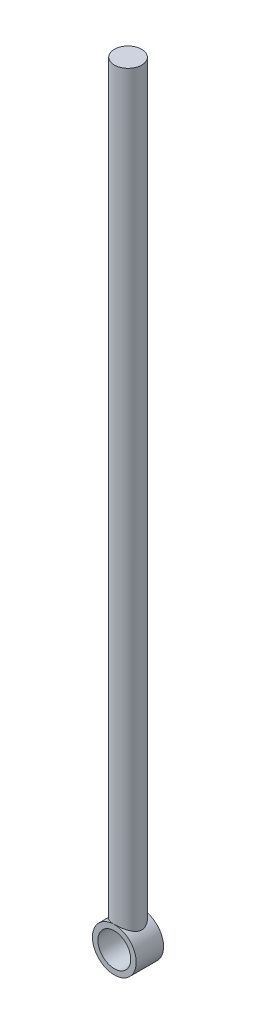
ISO-10303-21;
HEADER;
FILE_DESCRIPTION(('STEP AP214'),'2;1');
FILE_NAME('part.step','',(''),(''),'','','');
FILE_SCHEMA(('AUTOMOTIVE_DESIGN { 1 0 10303 214 1 1 1 1 }'));
ENDSEC;
DATA;
#1=APPLICATION_CONTEXT('core data for automotive mechanical design processes');
#2=APPLICATION_PROTOCOL_DEFINITION('international standard','automotive_design',2000,#1);
#3=PRODUCT_CONTEXT('',#1,'mechanical');
#4=PRODUCT('Part','Part','',(#3));
#5=PRODUCT_RELATED_PRODUCT_CATEGORY('part','',(#4));
#6=PRODUCT_DEFINITION_FORMATION('','',#4);
#7=PRODUCT_DEFINITION_CONTEXT('part definition',#1,'design');
#8=PRODUCT_DEFINITION('design','',#6,#7);
#9=PRODUCT_DEFINITION_SHAPE('','',#8);
#10=(LENGTH_UNIT() NAMED_UNIT(*) SI_UNIT(.MILLI.,.METRE.));
#11=(NAMED_UNIT(*) PLANE_ANGLE_UNIT() SI_UNIT($,.RADIAN.));
#12=(NAMED_UNIT(*) SI_UNIT($,.STERADIAN.) SOLID_ANGLE_UNIT());
#13=UNCERTAINTY_MEASURE_WITH_UNIT(LENGTH_MEASURE(1.E-05),#10,'distance_accuracy_value','');
#14=(GEOMETRIC_REPRESENTATION_CONTEXT(3) GLOBAL_UNCERTAINTY_ASSIGNED_CONTEXT((#13)) GLOBAL_UNIT_ASSIGNED_CONTEXT((#10,
#11,#12)) REPRESENTATION_CONTEXT('',''));
#15=CARTESIAN_POINT('',(0.,0.,0.));
#16=DIRECTION('',(0.,0.,1.));
#17=DIRECTION('',(1.,0.,0.));
#18=AXIS2_PLACEMENT_3D('',#15,#16,#17);
#19=CARTESIAN_POINT('',(0.,0.,5.));
#20=DIRECTION('',(0.,0.,-1.));
#21=DIRECTION('',(-1.,0.,0.));
#22=AXIS2_PLACEMENT_3D('',#19,#20,#21);
#23=CYLINDRICAL_SURFACE('',#22,4.);
#24=CARTESIAN_POINT('',(0.,0.,5.));
#25=DIRECTION('',(0.,0.,1.));
#26=DIRECTION('',(1.,0.,0.));
#27=AXIS2_PLACEMENT_3D('',#24,#25,#26);
#28=CIRCLE('',#27,4.);
#29=CARTESIAN_POINT('',(4.,0.,5.));
#30=VERTEX_POINT('',#29);
#31=EDGE_CURVE('E91',#30,#30,#28,.T.);
#32=ORIENTED_EDGE('',*,*,#31,.F.);
#33=EDGE_LOOP('',(#32));
#34=FACE_BOUND('',#33,.T.);
#35=CARTESIAN_POINT('',(-0.212094342694303,3.99437304089103,0.));
#36=CARTESIAN_POINT('',(-0.277635425408281,3.99090636161698,0.00556866203034279));
#37=CARTESIAN_POINT('',(-0.342852676372404,3.98581278387243,0.0137382670174154));
#38=CARTESIAN_POINT('',(-0.472097905739335,3.97256994083765,0.0350971233239997));
#39=CARTESIAN_POINT('',(-0.536126716926794,3.96442290714975,0.0482827088455906));
#40=CARTESIAN_POINT('',(-0.662161392903697,3.9453246032861,0.0794038382104378));
#41=CARTESIAN_POINT('',(-0.724177284261335,3.93439090418593,0.0973096425499083));
#42=CARTESIAN_POINT('',(-0.84618327217585,3.90996807056487,0.137668606910204));
#43=CARTESIAN_POINT('',(-0.906173063040739,3.89647855244111,0.160122449581061));
#44=CARTESIAN_POINT('',(-1.08224499252167,3.85270057759922,0.233803993620125));
#45=CARTESIAN_POINT('',(-1.19487399066409,3.81903209572113,0.291463555467339));
#46=CARTESIAN_POINT('',(-1.40879154869735,3.74541936662533,0.421912692963679));
#47=CARTESIAN_POINT('',(-1.51006269615616,3.70546570308566,0.494725023878487));
#48=CARTESIAN_POINT('',(-1.70923895341809,3.61820793944922,0.661514878389953));
#49=CARTESIAN_POINT('',(-1.80584974069344,3.57056704741322,0.756864866122376));
#50=CARTESIAN_POINT('',(-1.98260843390093,3.47553717490005,0.962045322727953));
#51=CARTESIAN_POINT('',(-2.06273406457208,3.42814861847129,1.07189505955946));
#52=CARTESIAN_POINT('',(-2.21184459422436,3.33410266150031,1.31621294161143));
#53=CARTESIAN_POINT('',(-2.27899628040701,3.28796156360036,1.45203532985045));
#54=CARTESIAN_POINT('',(-2.36100245199905,3.22905683183157,1.6654736906845));
#55=CARTESIAN_POINT('',(-2.38520649617299,3.21114928885188,1.7381792903859));
#56=CARTESIAN_POINT('',(-2.42700372583669,3.17967482004999,1.88635850571834));
#57=CARTESIAN_POINT('',(-2.44460049584837,3.16610554126497,1.96183059603114));
#58=CARTESIAN_POINT('',(-2.47868512930007,3.13955335327286,2.14704072569847));
#59=CARTESIAN_POINT('',(-2.49160464668836,3.12920923519556,2.25785987214205));
#60=CARTESIAN_POINT('',(-2.5024632186234,3.12053365161235,2.48062653628668));
#61=CARTESIAN_POINT('',(-2.50041209710871,3.1221943084017,2.59257326588967));
#62=CARTESIAN_POINT('',(-2.48151124325573,3.13723377012631,2.81418274646222));
#63=CARTESIAN_POINT('',(-2.46468593877979,3.15059323197699,2.92384896181254));
#64=CARTESIAN_POINT('',(-2.41720912027568,3.18715878288787,3.13844927894854));
#65=CARTESIAN_POINT('',(-2.38654532335623,3.21037361837949,3.24337908553936));
#66=CARTESIAN_POINT('',(-2.31013941406388,3.26582590876777,3.45358964441859));
#67=CARTESIAN_POINT('',(-2.26351640756705,3.29856813538876,3.55841242845811));
#68=CARTESIAN_POINT('',(-2.15730444644563,3.36899086307536,3.75944310482348));
#69=CARTESIAN_POINT('',(-2.09770885684788,3.40667388723078,3.8556465530194));
#70=CARTESIAN_POINT('',(-1.95243354883458,3.49235572493626,4.05838002000874));
#71=CARTESIAN_POINT('',(-1.86390045238364,3.54082925755464,4.16267651505651));
#72=CARTESIAN_POINT('',(-1.67050984340395,3.63607424533146,4.35595454843289));
#73=CARTESIAN_POINT('',(-1.56563768563211,3.68284412659139,4.44492219486299));
#74=CARTESIAN_POINT('',(-1.33170912006632,3.77406382913035,4.6120372090512));
#75=CARTESIAN_POINT('',(-1.20137331046223,3.81800683714295,4.68869378670754));
#76=CARTESIAN_POINT('',(-0.926143315906754,3.89391077340457,4.81806444289206));
#77=CARTESIAN_POINT('',(-0.781268891998625,3.92588769368969,4.87081049664175));
#78=CARTESIAN_POINT('',(-0.499942810841997,3.9708730146435,4.94426244543754));
#79=CARTESIAN_POINT('',(-0.364599514477382,3.98571112884782,4.96807757360525));
#80=CARTESIAN_POINT('',(-0.0910689172232064,4.00130122676496,4.99308967147354));
#81=CARTESIAN_POINT('',(0.0471160269325314,4.00206444649915,4.99430468290718));
#82=CARTESIAN_POINT('',(0.304491305142984,3.99022136999018,4.97531773343442));
#83=CARTESIAN_POINT('',(0.423959101005391,3.9792195270088,4.95768609870065));
#84=CARTESIAN_POINT('',(0.657843693737731,3.94729942609182,4.90585545240177));
#85=CARTESIAN_POINT('',(0.772259899750995,3.92638001149365,4.87165450838766));
#86=CARTESIAN_POINT('',(0.996203317834851,3.87570601847456,4.78712888520829));
#87=CARTESIAN_POINT('',(1.10553988331948,3.84574591188251,4.7364267000824));
#88=CARTESIAN_POINT('',(1.31435952738332,3.77948109157972,4.62094282405548));
#89=CARTESIAN_POINT('',(1.41383979218034,3.74317457422239,4.55615712934984));
#90=CARTESIAN_POINT('',(1.61435542236357,3.66156826449169,4.40454576592732));
#91=CARTESIAN_POINT('',(1.71381162927832,3.61571533058011,4.31592979542481));
#92=CARTESIAN_POINT('',(1.89736506740851,3.52287016905725,4.1242810769404));
#93=CARTESIAN_POINT('',(1.98143735182784,3.47587622850257,4.02122538275902));
#94=CARTESIAN_POINT('',(2.14160149748118,3.37982584088709,3.78931589615484));
#95=CARTESIAN_POINT('',(2.21562982067839,3.33116459564692,3.65885579890288));
#96=CARTESIAN_POINT('',(2.33998628482645,3.24503199682297,3.38378850942095));
#97=CARTESIAN_POINT('',(2.39037418720668,3.20753251582472,3.23921811824783));
#98=CARTESIAN_POINT('',(2.45384156200607,3.15907897359258,2.98188098827005));
#99=CARTESIAN_POINT('',(2.47342021040485,3.14363018640994,2.87156104722125));
#100=CARTESIAN_POINT('',(2.4975605589976,3.12449155370212,2.64832573055822));
#101=CARTESIAN_POINT('',(2.50213849481646,3.1207889950951,2.53541329429049));
#102=CARTESIAN_POINT('',(2.49600315168168,3.12569642289848,2.31025180450028));
#103=CARTESIAN_POINT('',(2.4852839232845,3.13431119982621,2.19800302614271));
#104=CARTESIAN_POINT('',(2.44921323864565,3.16257197564383,1.97728766630991));
#105=CARTESIAN_POINT('',(2.42384835339136,3.1822280982029,1.86882465303122));
#106=CARTESIAN_POINT('',(2.35900884531761,3.23059320584524,1.65565702117138));
#107=CARTESIAN_POINT('',(2.31923353711854,3.25949344567363,1.55108926087009));
#108=CARTESIAN_POINT('',(2.22702821054702,3.32317350116561,1.34965804700241));
#109=CARTESIAN_POINT('',(2.17459337241772,3.35795555464829,1.25279754647546));
#110=CARTESIAN_POINT('',(2.04605265974581,3.43809803149417,1.04838157130486));
#111=CARTESIAN_POINT('',(1.96729357418796,3.48415763186043,0.942763915420813));
#112=CARTESIAN_POINT('',(1.79416719720306,3.57639566834278,0.745061704463637));
#113=CARTESIAN_POINT('',(1.69978019899335,3.62257418109207,0.652994516983127));
#114=CARTESIAN_POINT('',(1.4834829920427,3.71684243024481,0.473188650783031));
#115=CARTESIAN_POINT('',(1.3595940994801,3.76441373706324,0.387530667748136));
#116=CARTESIAN_POINT('',(1.0959586605044,3.84940666902203,0.23895690356101));
#117=CARTESIAN_POINT('',(0.956255608025164,3.88685521687223,0.175980646120924));
#118=CARTESIAN_POINT('',(0.715024143096145,3.93678848323059,0.0932863576493088));
#119=CARTESIAN_POINT('',(0.616871108165348,3.95342957920306,0.0661398370398337));
#120=CARTESIAN_POINT('',(0.466913933364799,3.97297706929917,0.0344415503140964));
#121=CARTESIAN_POINT('',(0.416387682214137,3.97859533008281,0.0253715388092875));
#122=CARTESIAN_POINT('',(0.31467392779513,3.98793144958376,0.0103362029497806));
#123=CARTESIAN_POINT('',(0.263486078442192,3.99164826868068,0.0043725769906966));
#124=CARTESIAN_POINT('',(0.212094342694303,3.99437304089103,0.));
#125=B_SPLINE_CURVE_WITH_KNOTS('',3,(#35,#36,#37,#38,#39,#40,#41,#42,#43,#44,#45,#46,#47,#48,
#49,#50,#51,#52,#53,#54,#55,#56,#57,#58,#59,#60,#61,#62,#63,#64,#65,#66,#67,#68,#69,#70,#71,#72,
#73,#74,#75,#76,#77,#78,#79,#80,#81,#82,#83,#84,#85,#86,#87,#88,#89,#90,#91,#92,#93,#94,#95,#96,
#97,#98,#99,#100,#101,#102,#103,#104,#105,#106,#107,#108,#109,#110,#111,#112,#113,#114,#115,
#116,#117,#118,#119,#120,#121,#122,#123,#124),.UNSPECIFIED.,.F.,.F.,(4,2,2,2,2,2,2,2,2,2,2,2,2,
2,2,2,2,2,2,2,2,2,2,2,2,2,2,2,2,2,2,2,2,2,2,2,2,2,2,2,2,2,2,2,4),(0.,0.197509238975001,
0.394874409943418,0.591024638084671,0.787204329767948,1.17819035727024,1.56976783022385,
1.99958209297295,2.42997337418732,2.90209099041843,3.13779755903606,3.37337606874624,
3.70787583201536,4.04215611169703,4.37588472572737,4.70991013790603,5.06656843207678,
5.42340957355087,5.85704889880068,6.29107916956674,6.76079053281217,7.22987189082352,
7.6420816840891,8.05396239504911,8.41607063747904,8.77822112211781,9.1493196180418,
9.52052375194552,9.94148807765986,10.3631291100316,10.8337806390324,11.3032358945418,
11.6410767051544,11.9785517417047,12.316158066376,12.65407444444,12.9994912657099,
13.3450398025885,13.7621321940604,14.1797546012399,14.6511048071461,15.1211887819094,
15.4297624112924,15.5845626455669,15.7394474272361),.UNSPECIFIED.);
#126=CARTESIAN_POINT('',(-0.212094342694303,3.99437304089103,0.));
#127=VERTEX_POINT('',#126);
#128=CARTESIAN_POINT('',(0.212094342694303,3.99437304089103,0.));
#129=VERTEX_POINT('',#128);
#130=EDGE_CURVE('E90',#127,#129,#125,.T.);
#131=ORIENTED_EDGE('',*,*,#130,.F.);
#132=CARTESIAN_POINT('',(0.,0.,0.));
#133=DIRECTION('',(0.,0.,1.));
#134=DIRECTION('',(1.,0.,0.));
#135=AXIS2_PLACEMENT_3D('',#132,#133,#134);
#136=CIRCLE('',#135,4.);
#137=EDGE_CURVE('E94',#127,#129,#136,.T.);
#138=ORIENTED_EDGE('',*,*,#137,.T.);
#139=EDGE_LOOP('',(#131,#138));
#140=FACE_BOUND('',#139,.T.);
#141=ADVANCED_FACE('F35',(#34,#140),#23,.T.);
#142=CARTESIAN_POINT('',(0.,0.,0.));
#143=DIRECTION('',(0.,0.,1.));
#144=DIRECTION('',(1.,0.,0.));
#145=AXIS2_PLACEMENT_3D('',#142,#143,#144);
#146=PLANE('',#145);
#147=DIRECTION('',(0.,-1.,0.));
#148=VECTOR('',#147,1.);
#149=CARTESIAN_POINT('',(-0.212094342694303,140.,0.));
#150=LINE('',#149,#148);
#151=CARTESIAN_POINT('',(-0.212094342694303,2.99249327314149,0.));
#152=VERTEX_POINT('',#151);
#153=EDGE_CURVE('E43',#152,#127,#150,.F.);
#154=ORIENTED_EDGE('',*,*,#153,.F.);
#155=CARTESIAN_POINT('',(0.,0.,0.));
#156=DIRECTION('',(0.,0.,1.));
#157=DIRECTION('',(1.,0.,0.));
#158=AXIS2_PLACEMENT_3D('',#155,#156,#157);
#159=CIRCLE('',#158,3.);
#160=CARTESIAN_POINT('',(0.212094342694303,2.99249327314149,0.));
#161=VERTEX_POINT('',#160);
#162=EDGE_CURVE('E85',#152,#161,#159,.T.);
#163=ORIENTED_EDGE('',*,*,#162,.T.);
#164=DIRECTION('',(0.,-1.,0.));
#165=VECTOR('',#164,1.);
#166=CARTESIAN_POINT('',(0.212094342694303,140.,0.));
#167=LINE('',#166,#165);
#168=EDGE_CURVE('E56',#129,#161,#167,.T.);
#169=ORIENTED_EDGE('',*,*,#168,.F.);
#170=ORIENTED_EDGE('',*,*,#137,.F.);
#171=EDGE_LOOP('',(#154,#163,#169,#170));
#172=FACE_BOUND('',#171,.T.);
#173=ADVANCED_FACE('F87',(#172),#146,.F.);
#174=CARTESIAN_POINT('',(0.,0.,5.));
#175=DIRECTION('',(0.,0.,1.));
#176=DIRECTION('',(1.,0.,0.));
#177=AXIS2_PLACEMENT_3D('',#174,#175,#176);
#178=PLANE('',#177);
#179=CARTESIAN_POINT('',(0.,0.,5.));
#180=DIRECTION('',(0.,0.,1.));
#181=DIRECTION('',(1.,0.,0.));
#182=AXIS2_PLACEMENT_3D('',#179,#180,#181);
#183=CIRCLE('',#182,3.);
#184=CARTESIAN_POINT('',(3.,0.,5.));
#185=VERTEX_POINT('',#184);
#186=EDGE_CURVE('E88',#185,#185,#183,.T.);
#187=ORIENTED_EDGE('',*,*,#186,.F.);
#188=EDGE_LOOP('',(#187));
#189=FACE_BOUND('',#188,.T.);
#190=ORIENTED_EDGE('',*,*,#31,.T.);
#191=EDGE_LOOP('',(#190));
#192=FACE_BOUND('',#191,.T.);
#193=ADVANCED_FACE('F111',(#189,#192),#178,.T.);
#194=CARTESIAN_POINT('',(0.,140.,2.49098695094877));
#195=DIRECTION('',(0.,-1.,0.));
#196=DIRECTION('',(0.,0.,-1.));
#197=AXIS2_PLACEMENT_3D('',#194,#195,#196);
#198=CYLINDRICAL_SURFACE('',#197,2.5);
#199=CARTESIAN_POINT('',(0.,140.,2.49098695094877));
#200=DIRECTION('',(0.,1.,0.));
#201=DIRECTION('',(0.,0.,1.));
#202=AXIS2_PLACEMENT_3D('',#199,#200,#201);
#203=CIRCLE('',#202,2.5);
#204=CARTESIAN_POINT('',(0.,140.,4.99098695094877));
#205=VERTEX_POINT('',#204);
#206=EDGE_CURVE('E104',#205,#205,#203,.T.);
#207=ORIENTED_EDGE('',*,*,#206,.F.);
#208=EDGE_LOOP('',(#207));
#209=FACE_BOUND('',#208,.T.);
#210=CARTESIAN_POINT('',(0.,0.,2.49098695094877));
#211=DIRECTION('',(0.,1.,0.));
#212=DIRECTION('',(0.,0.,1.));
#213=AXIS2_PLACEMENT_3D('',#210,#211,#212);
#214=CIRCLE('',#213,2.5);
#215=CARTESIAN_POINT('',(0.212094342694303,0.,0.));
#216=VERTEX_POINT('',#215);
#217=CARTESIAN_POINT('',(-0.212094342694303,0.,0.));
#218=VERTEX_POINT('',#217);
#219=EDGE_CURVE('E80',#216,#218,#214,.T.);
#220=ORIENTED_EDGE('',*,*,#219,.T.);
#221=EDGE_CURVE('E11',#218,#152,#150,.F.);
#222=ORIENTED_EDGE('',*,*,#221,.T.);
#223=ORIENTED_EDGE('',*,*,#153,.T.);
#224=ORIENTED_EDGE('',*,*,#130,.T.);
#225=ORIENTED_EDGE('',*,*,#168,.T.);
#226=DIRECTION('',(0.,-1.,0.));
#227=VECTOR('',#226,1.);
#228=CARTESIAN_POINT('',(0.212094342694303,140.,0.));
#229=LINE('',#228,#227);
#230=EDGE_CURVE('E72',#216,#161,#229,.F.);
#231=ORIENTED_EDGE('',*,*,#230,.F.);
#232=EDGE_LOOP('',(#220,#222,#223,#224,#225,#231));
#233=FACE_BOUND('',#232,.T.);
#234=ADVANCED_FACE('F89',(#209,#233),#198,.T.);
#235=CARTESIAN_POINT('',(0.,0.,2.49098695094877));
#236=DIRECTION('',(0.,1.,0.));
#237=DIRECTION('',(0.,0.,1.));
#238=AXIS2_PLACEMENT_3D('',#235,#236,#237);
#239=PLANE('',#238);
#240=ORIENTED_EDGE('',*,*,#219,.F.);
#241=DIRECTION('',(-1.,0.,0.));
#242=VECTOR('',#241,1.);
#243=CARTESIAN_POINT('',(0.,0.,0.));
#244=LINE('',#243,#242);
#245=EDGE_CURVE('E77',#216,#218,#244,.T.);
#246=ORIENTED_EDGE('',*,*,#245,.T.);
#247=EDGE_LOOP('',(#240,#246));
#248=FACE_BOUND('',#247,.T.);
#249=ADVANCED_FACE('F110',(#248),#239,.F.);
#250=CARTESIAN_POINT('',(0.,140.,2.49098695094877));
#251=DIRECTION('',(0.,1.,0.));
#252=DIRECTION('',(0.,0.,1.));
#253=AXIS2_PLACEMENT_3D('',#250,#251,#252);
#254=PLANE('',#253);
#255=ORIENTED_EDGE('',*,*,#206,.T.);
#256=EDGE_LOOP('',(#255));
#257=FACE_BOUND('',#256,.T.);
#258=ADVANCED_FACE('F133',(#257),#254,.T.);
#259=CARTESIAN_POINT('',(0.,0.,0.));
#260=DIRECTION('',(0.,0.,1.));
#261=DIRECTION('',(1.,0.,0.));
#262=AXIS2_PLACEMENT_3D('',#259,#260,#261);
#263=PLANE('',#262);
#264=ORIENTED_EDGE('',*,*,#221,.F.);
#265=ORIENTED_EDGE('',*,*,#245,.F.);
#266=ORIENTED_EDGE('',*,*,#230,.T.);
#267=EDGE_CURVE('E75',#161,#152,#159,.T.);
#268=ORIENTED_EDGE('',*,*,#267,.T.);
#269=EDGE_LOOP('',(#264,#265,#266,#268));
#270=FACE_BOUND('',#269,.T.);
#271=ADVANCED_FACE('F74',(#270),#263,.T.);
#272=CARTESIAN_POINT('',(0.,0.,0.));
#273=DIRECTION('',(0.,0.,1.));
#274=DIRECTION('',(1.,0.,0.));
#275=AXIS2_PLACEMENT_3D('',#272,#273,#274);
#276=CYLINDRICAL_SURFACE('',#275,3.);
#277=ORIENTED_EDGE('',*,*,#267,.F.);
#278=ORIENTED_EDGE('',*,*,#162,.F.);
#279=EDGE_LOOP('',(#277,#278));
#280=FACE_BOUND('',#279,.T.);
#281=ORIENTED_EDGE('',*,*,#186,.T.);
#282=EDGE_LOOP('',(#281));
#283=FACE_BOUND('',#282,.T.);
#284=ADVANCED_FACE('F83',(#280,#283),#276,.F.);
#285=CLOSED_SHELL('',(#141,#173,#193,#234,#249,#258,#271,#284));
#286=MANIFOLD_SOLID_BREP('B2',#285);
#287=ADVANCED_BREP_SHAPE_REPRESENTATION('',(#18,#286),#14);
#288=SHAPE_DEFINITION_REPRESENTATION(#9,#287);
ENDSEC;
END-ISO-10303-21;
